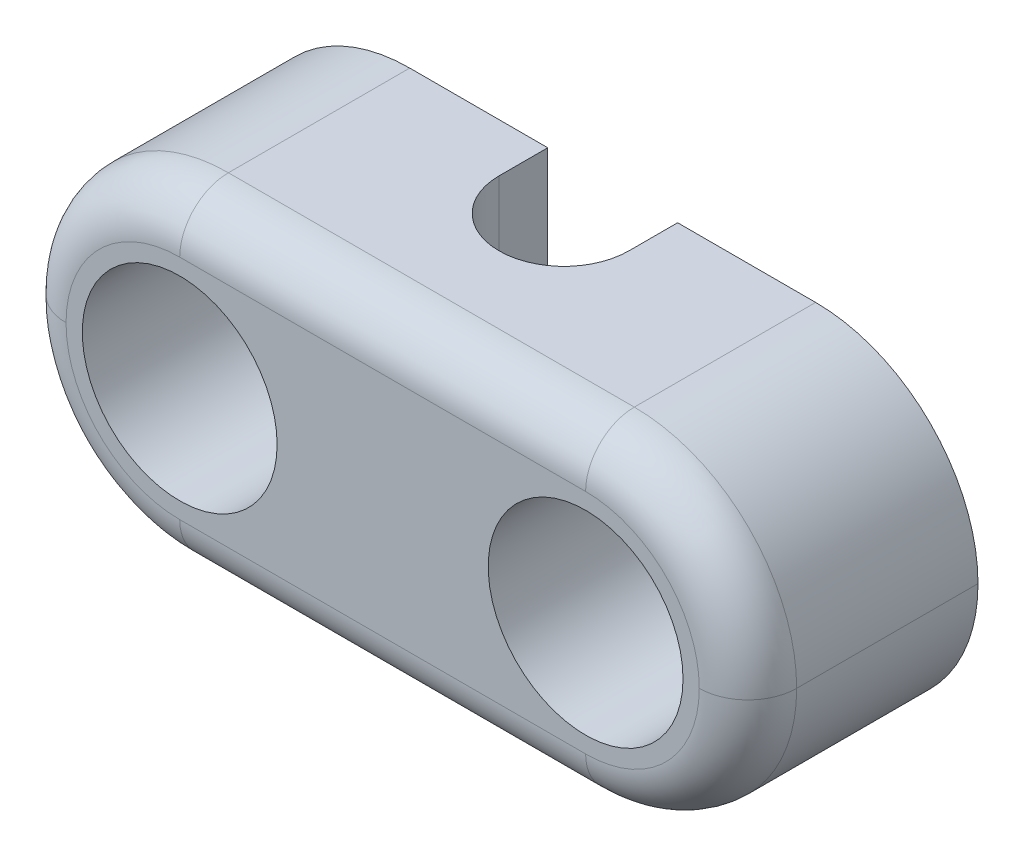
ISO-10303-21;
HEADER;
FILE_DESCRIPTION(('STEP AP214'),'2;1');
FILE_NAME('part.step','',(''),(''),'','','');
FILE_SCHEMA(('AUTOMOTIVE_DESIGN { 1 0 10303 214 1 1 1 1 }'));
ENDSEC;
DATA;
#1=APPLICATION_CONTEXT('core data for automotive mechanical design processes');
#2=APPLICATION_PROTOCOL_DEFINITION('international standard','automotive_design',2000,#1);
#3=PRODUCT_CONTEXT('',#1,'mechanical');
#4=PRODUCT('Part','Part','',(#3));
#5=PRODUCT_RELATED_PRODUCT_CATEGORY('part','',(#4));
#6=PRODUCT_DEFINITION_FORMATION('','',#4);
#7=PRODUCT_DEFINITION_CONTEXT('part definition',#1,'design');
#8=PRODUCT_DEFINITION('design','',#6,#7);
#9=PRODUCT_DEFINITION_SHAPE('','',#8);
#10=(LENGTH_UNIT() NAMED_UNIT(*) SI_UNIT(.MILLI.,.METRE.));
#11=(NAMED_UNIT(*) PLANE_ANGLE_UNIT() SI_UNIT($,.RADIAN.));
#12=(NAMED_UNIT(*) SI_UNIT($,.STERADIAN.) SOLID_ANGLE_UNIT());
#13=UNCERTAINTY_MEASURE_WITH_UNIT(LENGTH_MEASURE(1.E-05),#10,'distance_accuracy_value','');
#14=(GEOMETRIC_REPRESENTATION_CONTEXT(3) GLOBAL_UNCERTAINTY_ASSIGNED_CONTEXT((#13)) GLOBAL_UNIT_ASSIGNED_CONTEXT((#10,
#11,#12)) REPRESENTATION_CONTEXT('',''));
#15=CARTESIAN_POINT('',(0.,0.,0.));
#16=DIRECTION('',(0.,0.,1.));
#17=DIRECTION('',(1.,0.,0.));
#18=AXIS2_PLACEMENT_3D('',#15,#16,#17);
#19=CARTESIAN_POINT('',(0.,0.,0.));
#20=DIRECTION('',(0.,0.,-1.));
#21=DIRECTION('',(-1.,0.,0.));
#22=AXIS2_PLACEMENT_3D('',#19,#20,#21);
#23=PLANE('',#22);
#24=DIRECTION('',(0.,1.,0.));
#25=VECTOR('',#24,1.);
#26=CARTESIAN_POINT('',(-4.,0.,0.));
#27=LINE('',#26,#25);
#28=CARTESIAN_POINT('',(-4.,-10.,0.));
#29=VERTEX_POINT('',#28);
#30=CARTESIAN_POINT('',(-4.,10.,0.));
#31=VERTEX_POINT('',#30);
#32=EDGE_CURVE('E147',#29,#31,#27,.T.);
#33=ORIENTED_EDGE('',*,*,#32,.F.);
#34=DIRECTION('',(1.,0.,0.));
#35=VECTOR('',#34,1.);
#36=CARTESIAN_POINT('',(-22.5,-10.,0.));
#37=LINE('',#36,#35);
#38=CARTESIAN_POINT('',(-12.5,-10.,0.));
#39=VERTEX_POINT('',#38);
#40=EDGE_CURVE('E163',#39,#29,#37,.T.);
#41=ORIENTED_EDGE('',*,*,#40,.F.);
#42=CARTESIAN_POINT('',(-12.5,0.,0.));
#43=DIRECTION('',(0.,0.,-1.));
#44=DIRECTION('',(-1.,0.,0.));
#45=AXIS2_PLACEMENT_3D('',#42,#43,#44);
#46=CIRCLE('',#45,10.);
#47=CARTESIAN_POINT('',(-22.5,0.,0.));
#48=VERTEX_POINT('',#47);
#49=EDGE_CURVE('E176',#39,#48,#46,.T.);
#50=ORIENTED_EDGE('',*,*,#49,.T.);
#51=CARTESIAN_POINT('',(-12.5,0.,0.));
#52=DIRECTION('',(0.,0.,-1.));
#53=DIRECTION('',(-1.,0.,0.));
#54=AXIS2_PLACEMENT_3D('',#51,#52,#53);
#55=CIRCLE('',#54,10.);
#56=CARTESIAN_POINT('',(-12.5,10.,0.));
#57=VERTEX_POINT('',#56);
#58=EDGE_CURVE('E178',#48,#57,#55,.T.);
#59=ORIENTED_EDGE('',*,*,#58,.T.);
#60=DIRECTION('',(-1.,0.,0.));
#61=VECTOR('',#60,1.);
#62=CARTESIAN_POINT('',(-22.5,10.,0.));
#63=LINE('',#62,#61);
#64=EDGE_CURVE('E168',#31,#57,#63,.T.);
#65=ORIENTED_EDGE('',*,*,#64,.F.);
#66=EDGE_LOOP('',(#33,#41,#50,#59,#65));
#67=FACE_BOUND('',#66,.T.);
#68=CARTESIAN_POINT('',(-12.5,0.,0.));
#69=DIRECTION('',(0.,0.,1.));
#70=DIRECTION('',(1.,0.,0.));
#71=AXIS2_PLACEMENT_3D('',#68,#69,#70);
#72=CIRCLE('',#71,2.75);
#73=CARTESIAN_POINT('',(-9.75,0.,0.));
#74=VERTEX_POINT('',#73);
#75=EDGE_CURVE('E247',#74,#74,#72,.T.);
#76=ORIENTED_EDGE('',*,*,#75,.T.);
#77=EDGE_LOOP('',(#76));
#78=FACE_BOUND('',#77,.T.);
#79=ADVANCED_FACE('F38',(#67,#78),#23,.T.);
#80=CARTESIAN_POINT('',(-22.5,10.,14.1678726496991));
#81=DIRECTION('',(0.,-1.,0.));
#82=DIRECTION('',(0.,0.,-1.));
#83=AXIS2_PLACEMENT_3D('',#80,#81,#82);
#84=PLANE('',#83);
#85=DIRECTION('',(0.,0.,-1.));
#86=VECTOR('',#85,1.);
#87=CARTESIAN_POINT('',(-12.5,10.,14.1678726496991));
#88=LINE('',#87,#86);
#89=CARTESIAN_POINT('',(-12.5,10.,11.1678726496991));
#90=VERTEX_POINT('',#89);
#91=EDGE_CURVE('E167',#57,#90,#88,.F.);
#92=ORIENTED_EDGE('',*,*,#91,.T.);
#93=DIRECTION('',(-1.,0.,0.));
#94=VECTOR('',#93,1.);
#95=CARTESIAN_POINT('',(-22.5,10.,11.1678726496991));
#96=LINE('',#95,#94);
#97=CARTESIAN_POINT('',(12.5,10.,11.1678726496991));
#98=VERTEX_POINT('',#97);
#99=EDGE_CURVE('E212',#90,#98,#96,.F.);
#100=ORIENTED_EDGE('',*,*,#99,.T.);
#101=DIRECTION('',(0.,0.,-1.));
#102=VECTOR('',#101,1.);
#103=CARTESIAN_POINT('',(12.5,10.,14.1678726496991));
#104=LINE('',#103,#102);
#105=CARTESIAN_POINT('',(12.5,10.,0.));
#106=VERTEX_POINT('',#105);
#107=EDGE_CURVE('E174',#98,#106,#104,.T.);
#108=ORIENTED_EDGE('',*,*,#107,.T.);
#109=CARTESIAN_POINT('',(3.99999999999999,10.,0.));
#110=VERTEX_POINT('',#109);
#111=EDGE_CURVE('E164',#106,#110,#63,.T.);
#112=ORIENTED_EDGE('',*,*,#111,.T.);
#113=DIRECTION('',(0.,0.,1.));
#114=VECTOR('',#113,1.);
#115=CARTESIAN_POINT('',(4.,10.,14.1678726496991));
#116=LINE('',#115,#114);
#117=CARTESIAN_POINT('',(4.,10.,3.));
#118=VERTEX_POINT('',#117);
#119=EDGE_CURVE('E142',#110,#118,#116,.T.);
#120=ORIENTED_EDGE('',*,*,#119,.T.);
#121=CARTESIAN_POINT('',(0.,10.,3.));
#122=DIRECTION('',(0.,-1.,0.));
#123=DIRECTION('',(0.,0.,-1.));
#124=AXIS2_PLACEMENT_3D('',#121,#122,#123);
#125=CIRCLE('',#124,4.);
#126=CARTESIAN_POINT('',(-4.,10.,3.));
#127=VERTEX_POINT('',#126);
#128=EDGE_CURVE('E191',#118,#127,#125,.T.);
#129=ORIENTED_EDGE('',*,*,#128,.T.);
#130=DIRECTION('',(0.,0.,-1.));
#131=VECTOR('',#130,1.);
#132=CARTESIAN_POINT('',(-4.,10.,14.1678726496991));
#133=LINE('',#132,#131);
#134=EDGE_CURVE('E269',#127,#31,#133,.T.);
#135=ORIENTED_EDGE('',*,*,#134,.T.);
#136=ORIENTED_EDGE('',*,*,#64,.T.);
#137=EDGE_LOOP('',(#92,#100,#108,#112,#120,#129,#135,#136));
#138=FACE_BOUND('',#137,.T.);
#139=ADVANCED_FACE('F273',(#138),#84,.F.);
#140=CARTESIAN_POINT('',(-22.5,-10.,14.1678726496991));
#141=DIRECTION('',(0.,1.,0.));
#142=DIRECTION('',(0.,0.,1.));
#143=AXIS2_PLACEMENT_3D('',#140,#141,#142);
#144=PLANE('',#143);
#145=DIRECTION('',(0.,0.,-1.));
#146=VECTOR('',#145,1.);
#147=CARTESIAN_POINT('',(12.5,-10.,14.1678726496991));
#148=LINE('',#147,#146);
#149=CARTESIAN_POINT('',(12.5,-10.,0.));
#150=VERTEX_POINT('',#149);
#151=CARTESIAN_POINT('',(12.5,-10.,11.1678726496991));
#152=VERTEX_POINT('',#151);
#153=EDGE_CURVE('E148',#150,#152,#148,.F.);
#154=ORIENTED_EDGE('',*,*,#153,.T.);
#155=DIRECTION('',(1.,0.,0.));
#156=VECTOR('',#155,1.);
#157=CARTESIAN_POINT('',(-22.5,-10.,11.1678726496991));
#158=LINE('',#157,#156);
#159=CARTESIAN_POINT('',(-12.5,-10.,11.1678726496991));
#160=VERTEX_POINT('',#159);
#161=EDGE_CURVE('E11',#152,#160,#158,.F.);
#162=ORIENTED_EDGE('',*,*,#161,.T.);
#163=DIRECTION('',(0.,0.,-1.));
#164=VECTOR('',#163,1.);
#165=CARTESIAN_POINT('',(-12.5,-10.,14.1678726496991));
#166=LINE('',#165,#164);
#167=EDGE_CURVE('E184',#160,#39,#166,.T.);
#168=ORIENTED_EDGE('',*,*,#167,.T.);
#169=ORIENTED_EDGE('',*,*,#40,.T.);
#170=DIRECTION('',(0.,0.,-1.));
#171=VECTOR('',#170,1.);
#172=CARTESIAN_POINT('',(-4.,-10.,0.));
#173=LINE('',#172,#171);
#174=CARTESIAN_POINT('',(-4.,-10.,3.));
#175=VERTEX_POINT('',#174);
#176=EDGE_CURVE('E262',#175,#29,#173,.T.);
#177=ORIENTED_EDGE('',*,*,#176,.F.);
#178=CARTESIAN_POINT('',(0.,-10.,3.));
#179=DIRECTION('',(0.,-1.,0.));
#180=DIRECTION('',(0.,0.,-1.));
#181=AXIS2_PLACEMENT_3D('',#178,#179,#180);
#182=CIRCLE('',#181,4.);
#183=CARTESIAN_POINT('',(4.,-10.,3.));
#184=VERTEX_POINT('',#183);
#185=EDGE_CURVE('E156',#184,#175,#182,.T.);
#186=ORIENTED_EDGE('',*,*,#185,.F.);
#187=DIRECTION('',(0.,0.,1.));
#188=VECTOR('',#187,1.);
#189=CARTESIAN_POINT('',(4.,-10.,0.));
#190=LINE('',#189,#188);
#191=CARTESIAN_POINT('',(4.,-10.,0.));
#192=VERTEX_POINT('',#191);
#193=EDGE_CURVE('E139',#192,#184,#190,.T.);
#194=ORIENTED_EDGE('',*,*,#193,.F.);
#195=EDGE_CURVE('E152',#192,#150,#37,.T.);
#196=ORIENTED_EDGE('',*,*,#195,.T.);
#197=EDGE_LOOP('',(#154,#162,#168,#169,#177,#186,#194,#196));
#198=FACE_BOUND('',#197,.T.);
#199=ADVANCED_FACE('F151',(#198),#144,.F.);
#200=CARTESIAN_POINT('',(0.,0.,14.1678726496991));
#201=DIRECTION('',(0.,0.,-1.));
#202=DIRECTION('',(-1.,0.,0.));
#203=AXIS2_PLACEMENT_3D('',#200,#201,#202);
#204=PLANE('',#203);
#205=CARTESIAN_POINT('',(-12.5,0.,14.1678726496991));
#206=DIRECTION('',(0.,0.,-1.));
#207=DIRECTION('',(-1.,0.,0.));
#208=AXIS2_PLACEMENT_3D('',#205,#206,#207);
#209=CIRCLE('',#208,7.);
#210=CARTESIAN_POINT('',(-12.5,7.,14.1678726496991));
#211=VERTEX_POINT('',#210);
#212=CARTESIAN_POINT('',(-19.5,0.,14.1678726496991));
#213=VERTEX_POINT('',#212);
#214=EDGE_CURVE('E202',#211,#213,#209,.F.);
#215=ORIENTED_EDGE('',*,*,#214,.T.);
#216=CARTESIAN_POINT('',(-12.5,0.,14.1678726496991));
#217=DIRECTION('',(0.,0.,-1.));
#218=DIRECTION('',(-1.,0.,0.));
#219=AXIS2_PLACEMENT_3D('',#216,#217,#218);
#220=CIRCLE('',#219,7.);
#221=CARTESIAN_POINT('',(-12.5,-7.,14.1678726496991));
#222=VERTEX_POINT('',#221);
#223=EDGE_CURVE('E204',#213,#222,#220,.F.);
#224=ORIENTED_EDGE('',*,*,#223,.T.);
#225=DIRECTION('',(1.,0.,0.));
#226=VECTOR('',#225,1.);
#227=CARTESIAN_POINT('',(0.,-7.,14.1678726496991));
#228=LINE('',#227,#226);
#229=CARTESIAN_POINT('',(12.5,-7.,14.1678726496991));
#230=VERTEX_POINT('',#229);
#231=EDGE_CURVE('E194',#222,#230,#228,.T.);
#232=ORIENTED_EDGE('',*,*,#231,.T.);
#233=CARTESIAN_POINT('',(12.5,0.,14.1678726496991));
#234=DIRECTION('',(0.,0.,-1.));
#235=DIRECTION('',(-1.,0.,0.));
#236=AXIS2_PLACEMENT_3D('',#233,#234,#235);
#237=CIRCLE('',#236,7.);
#238=CARTESIAN_POINT('',(19.5,0.,14.1678726496991));
#239=VERTEX_POINT('',#238);
#240=EDGE_CURVE('E196',#230,#239,#237,.F.);
#241=ORIENTED_EDGE('',*,*,#240,.T.);
#242=CARTESIAN_POINT('',(12.5,0.,14.1678726496991));
#243=DIRECTION('',(0.,0.,-1.));
#244=DIRECTION('',(-1.,0.,0.));
#245=AXIS2_PLACEMENT_3D('',#242,#243,#244);
#246=CIRCLE('',#245,7.);
#247=CARTESIAN_POINT('',(12.5,7.,14.1678726496991));
#248=VERTEX_POINT('',#247);
#249=EDGE_CURVE('E198',#239,#248,#246,.F.);
#250=ORIENTED_EDGE('',*,*,#249,.T.);
#251=DIRECTION('',(-1.,0.,0.));
#252=VECTOR('',#251,1.);
#253=CARTESIAN_POINT('',(0.,7.,14.1678726496991));
#254=LINE('',#253,#252);
#255=EDGE_CURVE('E200',#248,#211,#254,.T.);
#256=ORIENTED_EDGE('',*,*,#255,.T.);
#257=EDGE_LOOP('',(#215,#224,#232,#241,#250,#256));
#258=FACE_BOUND('',#257,.T.);
#259=CARTESIAN_POINT('',(-12.5,0.,14.1678726496991));
#260=DIRECTION('',(0.,0.,1.));
#261=DIRECTION('',(1.,0.,0.));
#262=AXIS2_PLACEMENT_3D('',#259,#260,#261);
#263=CIRCLE('',#262,6.);
#264=CARTESIAN_POINT('',(-6.5,0.,14.1678726496991));
#265=VERTEX_POINT('',#264);
#266=EDGE_CURVE('E231',#265,#265,#263,.T.);
#267=ORIENTED_EDGE('',*,*,#266,.F.);
#268=EDGE_LOOP('',(#267));
#269=FACE_BOUND('',#268,.T.);
#270=CARTESIAN_POINT('',(12.5,0.,14.1678726496991));
#271=DIRECTION('',(0.,0.,1.));
#272=DIRECTION('',(1.,0.,0.));
#273=AXIS2_PLACEMENT_3D('',#270,#271,#272);
#274=CIRCLE('',#273,6.);
#275=CARTESIAN_POINT('',(18.5,0.,14.1678726496991));
#276=VERTEX_POINT('',#275);
#277=EDGE_CURVE('E250',#276,#276,#274,.T.);
#278=ORIENTED_EDGE('',*,*,#277,.F.);
#279=EDGE_LOOP('',(#278));
#280=FACE_BOUND('',#279,.T.);
#281=ADVANCED_FACE('F302',(#258,#269,#280),#204,.F.);
#282=CARTESIAN_POINT('',(12.5,0.,0.));
#283=DIRECTION('',(0.,0.,1.));
#284=DIRECTION('',(1.,0.,0.));
#285=AXIS2_PLACEMENT_3D('',#282,#283,#284);
#286=CIRCLE('',#285,2.75);
#287=CARTESIAN_POINT('',(15.25,0.,0.));
#288=VERTEX_POINT('',#287);
#289=EDGE_CURVE('E157',#288,#288,#286,.T.);
#290=ORIENTED_EDGE('',*,*,#289,.T.);
#291=EDGE_LOOP('',(#290));
#292=FACE_BOUND('',#291,.T.);
#293=DIRECTION('',(0.,-1.,0.));
#294=VECTOR('',#293,1.);
#295=CARTESIAN_POINT('',(4.,0.,0.));
#296=LINE('',#295,#294);
#297=EDGE_CURVE('E135',#110,#192,#296,.T.);
#298=ORIENTED_EDGE('',*,*,#297,.F.);
#299=ORIENTED_EDGE('',*,*,#111,.F.);
#300=CARTESIAN_POINT('',(12.5,0.,0.));
#301=DIRECTION('',(0.,0.,-1.));
#302=DIRECTION('',(-1.,0.,0.));
#303=AXIS2_PLACEMENT_3D('',#300,#301,#302);
#304=CIRCLE('',#303,10.);
#305=CARTESIAN_POINT('',(22.5,0.,0.));
#306=VERTEX_POINT('',#305);
#307=EDGE_CURVE('E182',#106,#306,#304,.T.);
#308=ORIENTED_EDGE('',*,*,#307,.T.);
#309=CARTESIAN_POINT('',(12.5,0.,0.));
#310=DIRECTION('',(0.,0.,-1.));
#311=DIRECTION('',(-1.,0.,0.));
#312=AXIS2_PLACEMENT_3D('',#309,#310,#311);
#313=CIRCLE('',#312,10.);
#314=EDGE_CURVE('E162',#306,#150,#313,.T.);
#315=ORIENTED_EDGE('',*,*,#314,.T.);
#316=ORIENTED_EDGE('',*,*,#195,.F.);
#317=EDGE_LOOP('',(#298,#299,#308,#315,#316));
#318=FACE_BOUND('',#317,.T.);
#319=ADVANCED_FACE('F159',(#292,#318),#23,.T.);
#320=CARTESIAN_POINT('',(12.5,0.,14.1678726496991));
#321=DIRECTION('',(0.,0.,-1.));
#322=DIRECTION('',(-1.,0.,0.));
#323=AXIS2_PLACEMENT_3D('',#320,#321,#322);
#324=CYLINDRICAL_SURFACE('',#323,10.);
#325=DIRECTION('',(0.,0.,-1.));
#326=VECTOR('',#325,1.);
#327=CARTESIAN_POINT('',(22.5,0.,14.1678726496991));
#328=LINE('',#327,#326);
#329=CARTESIAN_POINT('',(22.5,0.,11.1678726496991));
#330=VERTEX_POINT('',#329);
#331=EDGE_CURVE('E187',#330,#306,#328,.T.);
#332=ORIENTED_EDGE('',*,*,#331,.F.);
#333=CARTESIAN_POINT('',(12.5,0.,11.1678726496991));
#334=DIRECTION('',(0.,0.,-1.));
#335=DIRECTION('',(-1.,0.,0.));
#336=AXIS2_PLACEMENT_3D('',#333,#334,#335);
#337=CIRCLE('',#336,10.);
#338=EDGE_CURVE('E47',#330,#152,#337,.T.);
#339=ORIENTED_EDGE('',*,*,#338,.T.);
#340=ORIENTED_EDGE('',*,*,#153,.F.);
#341=ORIENTED_EDGE('',*,*,#314,.F.);
#342=EDGE_LOOP('',(#332,#339,#340,#341));
#343=FACE_BOUND('',#342,.T.);
#344=ADVANCED_FACE('F331',(#343),#324,.T.);
#345=CARTESIAN_POINT('',(12.5,0.,14.1678726496991));
#346=DIRECTION('',(0.,0.,-1.));
#347=DIRECTION('',(-1.,0.,0.));
#348=AXIS2_PLACEMENT_3D('',#345,#346,#347);
#349=CYLINDRICAL_SURFACE('',#348,10.);
#350=ORIENTED_EDGE('',*,*,#107,.F.);
#351=CARTESIAN_POINT('',(12.5,0.,11.1678726496991));
#352=DIRECTION('',(0.,0.,-1.));
#353=DIRECTION('',(-1.,0.,0.));
#354=AXIS2_PLACEMENT_3D('',#351,#352,#353);
#355=CIRCLE('',#354,10.);
#356=EDGE_CURVE('E62',#98,#330,#355,.T.);
#357=ORIENTED_EDGE('',*,*,#356,.T.);
#358=ORIENTED_EDGE('',*,*,#331,.T.);
#359=ORIENTED_EDGE('',*,*,#307,.F.);
#360=EDGE_LOOP('',(#350,#357,#358,#359));
#361=FACE_BOUND('',#360,.T.);
#362=ADVANCED_FACE('F337',(#361),#349,.T.);
#363=CARTESIAN_POINT('',(-12.5,0.,14.1678726496991));
#364=DIRECTION('',(0.,0.,-1.));
#365=DIRECTION('',(-1.,0.,0.));
#366=AXIS2_PLACEMENT_3D('',#363,#364,#365);
#367=CYLINDRICAL_SURFACE('',#366,10.);
#368=ORIENTED_EDGE('',*,*,#167,.F.);
#369=CARTESIAN_POINT('',(-12.5,0.,11.1678726496991));
#370=DIRECTION('',(0.,0.,-1.));
#371=DIRECTION('',(-1.,0.,0.));
#372=AXIS2_PLACEMENT_3D('',#369,#370,#371);
#373=CIRCLE('',#372,10.);
#374=CARTESIAN_POINT('',(-22.5,0.,11.1678726496991));
#375=VERTEX_POINT('',#374);
#376=EDGE_CURVE('E207',#160,#375,#373,.T.);
#377=ORIENTED_EDGE('',*,*,#376,.T.);
#378=DIRECTION('',(0.,0.,-1.));
#379=VECTOR('',#378,1.);
#380=CARTESIAN_POINT('',(-22.5,0.,14.1678726496991));
#381=LINE('',#380,#379);
#382=EDGE_CURVE('E189',#48,#375,#381,.F.);
#383=ORIENTED_EDGE('',*,*,#382,.F.);
#384=ORIENTED_EDGE('',*,*,#49,.F.);
#385=EDGE_LOOP('',(#368,#377,#383,#384));
#386=FACE_BOUND('',#385,.T.);
#387=ADVANCED_FACE('F289',(#386),#367,.T.);
#388=CARTESIAN_POINT('',(-12.5,0.,14.1678726496991));
#389=DIRECTION('',(0.,0.,-1.));
#390=DIRECTION('',(-1.,0.,0.));
#391=AXIS2_PLACEMENT_3D('',#388,#389,#390);
#392=CYLINDRICAL_SURFACE('',#391,10.);
#393=ORIENTED_EDGE('',*,*,#382,.T.);
#394=CARTESIAN_POINT('',(-12.5,0.,11.1678726496991));
#395=DIRECTION('',(0.,0.,-1.));
#396=DIRECTION('',(-1.,0.,0.));
#397=AXIS2_PLACEMENT_3D('',#394,#395,#396);
#398=CIRCLE('',#397,10.);
#399=EDGE_CURVE('E210',#375,#90,#398,.T.);
#400=ORIENTED_EDGE('',*,*,#399,.T.);
#401=ORIENTED_EDGE('',*,*,#91,.F.);
#402=ORIENTED_EDGE('',*,*,#58,.F.);
#403=EDGE_LOOP('',(#393,#400,#401,#402));
#404=FACE_BOUND('',#403,.T.);
#405=ADVANCED_FACE('F310',(#404),#392,.T.);
#406=CARTESIAN_POINT('',(0.,12.,3.));
#407=DIRECTION('',(0.,-1.,0.));
#408=DIRECTION('',(0.,0.,-1.));
#409=AXIS2_PLACEMENT_3D('',#406,#407,#408);
#410=CYLINDRICAL_SURFACE('',#409,4.);
#411=DIRECTION('',(0.,-1.,0.));
#412=VECTOR('',#411,1.);
#413=CARTESIAN_POINT('',(4.,12.,3.));
#414=LINE('',#413,#412);
#415=EDGE_CURVE('E264',#118,#184,#414,.T.);
#416=ORIENTED_EDGE('',*,*,#415,.T.);
#417=ORIENTED_EDGE('',*,*,#185,.T.);
#418=DIRECTION('',(0.,-1.,0.));
#419=VECTOR('',#418,1.);
#420=CARTESIAN_POINT('',(-4.,12.,3.));
#421=LINE('',#420,#419);
#422=EDGE_CURVE('E265',#127,#175,#421,.T.);
#423=ORIENTED_EDGE('',*,*,#422,.F.);
#424=ORIENTED_EDGE('',*,*,#128,.F.);
#425=EDGE_LOOP('',(#416,#417,#423,#424));
#426=FACE_BOUND('',#425,.T.);
#427=ADVANCED_FACE('F277',(#426),#410,.F.);
#428=CARTESIAN_POINT('',(-4.,12.,0.));
#429=DIRECTION('',(-1.,0.,0.));
#430=DIRECTION('',(0.,0.,1.));
#431=AXIS2_PLACEMENT_3D('',#428,#429,#430);
#432=PLANE('',#431);
#433=ORIENTED_EDGE('',*,*,#422,.T.);
#434=ORIENTED_EDGE('',*,*,#176,.T.);
#435=ORIENTED_EDGE('',*,*,#32,.T.);
#436=ORIENTED_EDGE('',*,*,#134,.F.);
#437=EDGE_LOOP('',(#433,#434,#435,#436));
#438=FACE_BOUND('',#437,.T.);
#439=ADVANCED_FACE('F279',(#438),#432,.F.);
#440=CARTESIAN_POINT('',(4.,12.,0.));
#441=DIRECTION('',(1.,0.,0.));
#442=DIRECTION('',(0.,0.,-1.));
#443=AXIS2_PLACEMENT_3D('',#440,#441,#442);
#444=PLANE('',#443);
#445=ORIENTED_EDGE('',*,*,#297,.T.);
#446=ORIENTED_EDGE('',*,*,#193,.T.);
#447=ORIENTED_EDGE('',*,*,#415,.F.);
#448=ORIENTED_EDGE('',*,*,#119,.F.);
#449=EDGE_LOOP('',(#445,#446,#447,#448));
#450=FACE_BOUND('',#449,.T.);
#451=ADVANCED_FACE('F137',(#450),#444,.F.);
#452=CARTESIAN_POINT('',(12.5,0.,14.1678726496991));
#453=DIRECTION('',(0.,0.,1.));
#454=DIRECTION('',(1.,0.,0.));
#455=AXIS2_PLACEMENT_3D('',#452,#453,#454);
#456=CYLINDRICAL_SURFACE('',#455,2.75);
#457=ORIENTED_EDGE('',*,*,#289,.F.);
#458=EDGE_LOOP('',(#457));
#459=FACE_BOUND('',#458,.T.);
#460=CARTESIAN_POINT('',(12.5,0.,4.16787264969908));
#461=DIRECTION('',(0.,0.,1.));
#462=DIRECTION('',(1.,0.,0.));
#463=AXIS2_PLACEMENT_3D('',#460,#461,#462);
#464=CIRCLE('',#463,2.75);
#465=CARTESIAN_POINT('',(15.25,0.,4.16787264969908));
#466=VERTEX_POINT('',#465);
#467=EDGE_CURVE('E256',#466,#466,#464,.T.);
#468=ORIENTED_EDGE('',*,*,#467,.T.);
#469=EDGE_LOOP('',(#468));
#470=FACE_BOUND('',#469,.T.);
#471=ADVANCED_FACE('F341',(#459,#470),#456,.F.);
#472=CARTESIAN_POINT('',(15.25,0.,4.16787264969908));
#473=DIRECTION('',(0.,0.,-1.));
#474=DIRECTION('',(-1.,0.,0.));
#475=AXIS2_PLACEMENT_3D('',#472,#473,#474);
#476=PLANE('',#475);
#477=ORIENTED_EDGE('',*,*,#467,.F.);
#478=EDGE_LOOP('',(#477));
#479=FACE_BOUND('',#478,.T.);
#480=CARTESIAN_POINT('',(12.5,0.,4.16787264969908));
#481=DIRECTION('',(0.,0.,1.));
#482=DIRECTION('',(1.,0.,0.));
#483=AXIS2_PLACEMENT_3D('',#480,#481,#482);
#484=CIRCLE('',#483,6.);
#485=CARTESIAN_POINT('',(18.5,0.,4.16787264969908));
#486=VERTEX_POINT('',#485);
#487=EDGE_CURVE('E253',#486,#486,#484,.T.);
#488=ORIENTED_EDGE('',*,*,#487,.T.);
#489=EDGE_LOOP('',(#488));
#490=FACE_BOUND('',#489,.T.);
#491=ADVANCED_FACE('F344',(#479,#490),#476,.F.);
#492=CARTESIAN_POINT('',(12.5,0.,14.1678726496991));
#493=DIRECTION('',(0.,0.,1.));
#494=DIRECTION('',(1.,0.,0.));
#495=AXIS2_PLACEMENT_3D('',#492,#493,#494);
#496=CYLINDRICAL_SURFACE('',#495,6.);
#497=ORIENTED_EDGE('',*,*,#487,.F.);
#498=EDGE_LOOP('',(#497));
#499=FACE_BOUND('',#498,.T.);
#500=ORIENTED_EDGE('',*,*,#277,.T.);
#501=EDGE_LOOP('',(#500));
#502=FACE_BOUND('',#501,.T.);
#503=ADVANCED_FACE('F350',(#499,#502),#496,.F.);
#504=CARTESIAN_POINT('',(-12.5,0.,14.1678726496991));
#505=DIRECTION('',(0.,0.,1.));
#506=DIRECTION('',(1.,0.,0.));
#507=AXIS2_PLACEMENT_3D('',#504,#505,#506);
#508=CYLINDRICAL_SURFACE('',#507,2.75);
#509=ORIENTED_EDGE('',*,*,#75,.F.);
#510=EDGE_LOOP('',(#509));
#511=FACE_BOUND('',#510,.T.);
#512=CARTESIAN_POINT('',(-12.5,0.,4.16787264969908));
#513=DIRECTION('',(0.,0.,1.));
#514=DIRECTION('',(1.,0.,0.));
#515=AXIS2_PLACEMENT_3D('',#512,#513,#514);
#516=CIRCLE('',#515,2.75);
#517=CARTESIAN_POINT('',(-9.75,0.,4.16787264969908));
#518=VERTEX_POINT('',#517);
#519=EDGE_CURVE('E242',#518,#518,#516,.T.);
#520=ORIENTED_EDGE('',*,*,#519,.T.);
#521=EDGE_LOOP('',(#520));
#522=FACE_BOUND('',#521,.T.);
#523=ADVANCED_FACE('F356',(#511,#522),#508,.F.);
#524=CARTESIAN_POINT('',(-9.75,0.,4.16787264969908));
#525=DIRECTION('',(0.,0.,-1.));
#526=DIRECTION('',(-1.,0.,0.));
#527=AXIS2_PLACEMENT_3D('',#524,#525,#526);
#528=PLANE('',#527);
#529=ORIENTED_EDGE('',*,*,#519,.F.);
#530=EDGE_LOOP('',(#529));
#531=FACE_BOUND('',#530,.T.);
#532=CARTESIAN_POINT('',(-12.5,0.,4.16787264969908));
#533=DIRECTION('',(0.,0.,1.));
#534=DIRECTION('',(1.,0.,0.));
#535=AXIS2_PLACEMENT_3D('',#532,#533,#534);
#536=CIRCLE('',#535,6.);
#537=CARTESIAN_POINT('',(-6.5,0.,4.16787264969908));
#538=VERTEX_POINT('',#537);
#539=EDGE_CURVE('E237',#538,#538,#536,.T.);
#540=ORIENTED_EDGE('',*,*,#539,.T.);
#541=EDGE_LOOP('',(#540));
#542=FACE_BOUND('',#541,.T.);
#543=ADVANCED_FACE('F363',(#531,#542),#528,.F.);
#544=CARTESIAN_POINT('',(-12.5,0.,14.1678726496991));
#545=DIRECTION('',(0.,0.,1.));
#546=DIRECTION('',(1.,0.,0.));
#547=AXIS2_PLACEMENT_3D('',#544,#545,#546);
#548=CYLINDRICAL_SURFACE('',#547,6.);
#549=ORIENTED_EDGE('',*,*,#539,.F.);
#550=EDGE_LOOP('',(#549));
#551=FACE_BOUND('',#550,.T.);
#552=ORIENTED_EDGE('',*,*,#266,.T.);
#553=EDGE_LOOP('',(#552));
#554=FACE_BOUND('',#553,.T.);
#555=ADVANCED_FACE('F320',(#551,#554),#548,.F.);
#556=CARTESIAN_POINT('',(12.5,0.,11.1678726496991));
#557=DIRECTION('',(0.,0.,-1.));
#558=DIRECTION('',(-1.,0.,0.));
#559=AXIS2_PLACEMENT_3D('',#556,#557,#558);
#560=TOROIDAL_SURFACE('',#559,7.,3.);
#561=CARTESIAN_POINT('',(19.5,0.,11.1678726496991));
#562=DIRECTION('',(0.,-1.,0.));
#563=DIRECTION('',(0.,0.,-1.));
#564=AXIS2_PLACEMENT_3D('',#561,#562,#563);
#565=CIRCLE('',#564,3.);
#566=EDGE_CURVE('E225',#330,#239,#565,.T.);
#567=ORIENTED_EDGE('',*,*,#566,.F.);
#568=ORIENTED_EDGE('',*,*,#356,.F.);
#569=CARTESIAN_POINT('',(12.5,7.,11.1678726496991));
#570=DIRECTION('',(-1.,0.,0.));
#571=DIRECTION('',(0.,0.,1.));
#572=AXIS2_PLACEMENT_3D('',#569,#570,#571);
#573=CIRCLE('',#572,3.);
#574=EDGE_CURVE('E42',#248,#98,#573,.T.);
#575=ORIENTED_EDGE('',*,*,#574,.F.);
#576=ORIENTED_EDGE('',*,*,#249,.F.);
#577=EDGE_LOOP('',(#567,#568,#575,#576));
#578=FACE_BOUND('',#577,.T.);
#579=ADVANCED_FACE('F40',(#578),#560,.T.);
#580=CARTESIAN_POINT('',(0.,7.,11.1678726496991));
#581=DIRECTION('',(-1.,0.,0.));
#582=DIRECTION('',(0.,0.,1.));
#583=AXIS2_PLACEMENT_3D('',#580,#581,#582);
#584=CYLINDRICAL_SURFACE('',#583,3.);
#585=ORIENTED_EDGE('',*,*,#574,.T.);
#586=ORIENTED_EDGE('',*,*,#99,.F.);
#587=CARTESIAN_POINT('',(-12.5,7.,11.1678726496991));
#588=DIRECTION('',(-1.,0.,0.));
#589=DIRECTION('',(0.,0.,1.));
#590=AXIS2_PLACEMENT_3D('',#587,#588,#589);
#591=CIRCLE('',#590,3.);
#592=EDGE_CURVE('E223',#211,#90,#591,.T.);
#593=ORIENTED_EDGE('',*,*,#592,.F.);
#594=ORIENTED_EDGE('',*,*,#255,.F.);
#595=EDGE_LOOP('',(#585,#586,#593,#594));
#596=FACE_BOUND('',#595,.T.);
#597=ADVANCED_FACE('F312',(#596),#584,.T.);
#598=CARTESIAN_POINT('',(12.5,0.,11.1678726496991));
#599=DIRECTION('',(0.,0.,-1.));
#600=DIRECTION('',(-1.,0.,0.));
#601=AXIS2_PLACEMENT_3D('',#598,#599,#600);
#602=TOROIDAL_SURFACE('',#601,7.,3.);
#603=ORIENTED_EDGE('',*,*,#566,.T.);
#604=ORIENTED_EDGE('',*,*,#240,.F.);
#605=CARTESIAN_POINT('',(12.5,-7.,11.1678726496991));
#606=DIRECTION('',(-1.,0.,0.));
#607=DIRECTION('',(0.,0.,1.));
#608=AXIS2_PLACEMENT_3D('',#605,#606,#607);
#609=CIRCLE('',#608,3.);
#610=EDGE_CURVE('E220',#152,#230,#609,.T.);
#611=ORIENTED_EDGE('',*,*,#610,.F.);
#612=ORIENTED_EDGE('',*,*,#338,.F.);
#613=EDGE_LOOP('',(#603,#604,#611,#612));
#614=FACE_BOUND('',#613,.T.);
#615=ADVANCED_FACE('F314',(#614),#602,.T.);
#616=CARTESIAN_POINT('',(-12.5,0.,11.1678726496991));
#617=DIRECTION('',(0.,0.,-1.));
#618=DIRECTION('',(-1.,0.,0.));
#619=AXIS2_PLACEMENT_3D('',#616,#617,#618);
#620=TOROIDAL_SURFACE('',#619,7.,3.);
#621=ORIENTED_EDGE('',*,*,#592,.T.);
#622=ORIENTED_EDGE('',*,*,#399,.F.);
#623=CARTESIAN_POINT('',(-19.5,0.,11.1678726496991));
#624=DIRECTION('',(0.,-1.,0.));
#625=DIRECTION('',(0.,0.,-1.));
#626=AXIS2_PLACEMENT_3D('',#623,#624,#625);
#627=CIRCLE('',#626,3.);
#628=EDGE_CURVE('E218',#213,#375,#627,.T.);
#629=ORIENTED_EDGE('',*,*,#628,.F.);
#630=ORIENTED_EDGE('',*,*,#214,.F.);
#631=EDGE_LOOP('',(#621,#622,#629,#630));
#632=FACE_BOUND('',#631,.T.);
#633=ADVANCED_FACE('F307',(#632),#620,.T.);
#634=CARTESIAN_POINT('',(0.,-7.,11.1678726496991));
#635=DIRECTION('',(1.,0.,0.));
#636=DIRECTION('',(0.,0.,-1.));
#637=AXIS2_PLACEMENT_3D('',#634,#635,#636);
#638=CYLINDRICAL_SURFACE('',#637,3.);
#639=ORIENTED_EDGE('',*,*,#610,.T.);
#640=ORIENTED_EDGE('',*,*,#231,.F.);
#641=CARTESIAN_POINT('',(-12.5,-7.,11.1678726496991));
#642=DIRECTION('',(-1.,0.,0.));
#643=DIRECTION('',(0.,0.,1.));
#644=AXIS2_PLACEMENT_3D('',#641,#642,#643);
#645=CIRCLE('',#644,3.);
#646=EDGE_CURVE('E216',#160,#222,#645,.T.);
#647=ORIENTED_EDGE('',*,*,#646,.F.);
#648=ORIENTED_EDGE('',*,*,#161,.F.);
#649=EDGE_LOOP('',(#639,#640,#647,#648));
#650=FACE_BOUND('',#649,.T.);
#651=ADVANCED_FACE('F299',(#650),#638,.T.);
#652=CARTESIAN_POINT('',(-12.5,0.,11.1678726496991));
#653=DIRECTION('',(0.,0.,-1.));
#654=DIRECTION('',(-1.,0.,0.));
#655=AXIS2_PLACEMENT_3D('',#652,#653,#654);
#656=TOROIDAL_SURFACE('',#655,7.,3.);
#657=ORIENTED_EDGE('',*,*,#628,.T.);
#658=ORIENTED_EDGE('',*,*,#376,.F.);
#659=ORIENTED_EDGE('',*,*,#646,.T.);
#660=ORIENTED_EDGE('',*,*,#223,.F.);
#661=EDGE_LOOP('',(#657,#658,#659,#660));
#662=FACE_BOUND('',#661,.T.);
#663=ADVANCED_FACE('F293',(#662),#656,.T.);
#664=CLOSED_SHELL('',(#79,#139,#199,#281,#319,#344,#362,#387,#405,#427,#439,#451,#471,#491,#503,
#523,#543,#555,#579,#597,#615,#633,#651,#663));
#665=MANIFOLD_SOLID_BREP('B2',#664);
#666=ADVANCED_BREP_SHAPE_REPRESENTATION('',(#18,#665),#14);
#667=SHAPE_DEFINITION_REPRESENTATION(#9,#666);
ENDSEC;
END-ISO-10303-21;
